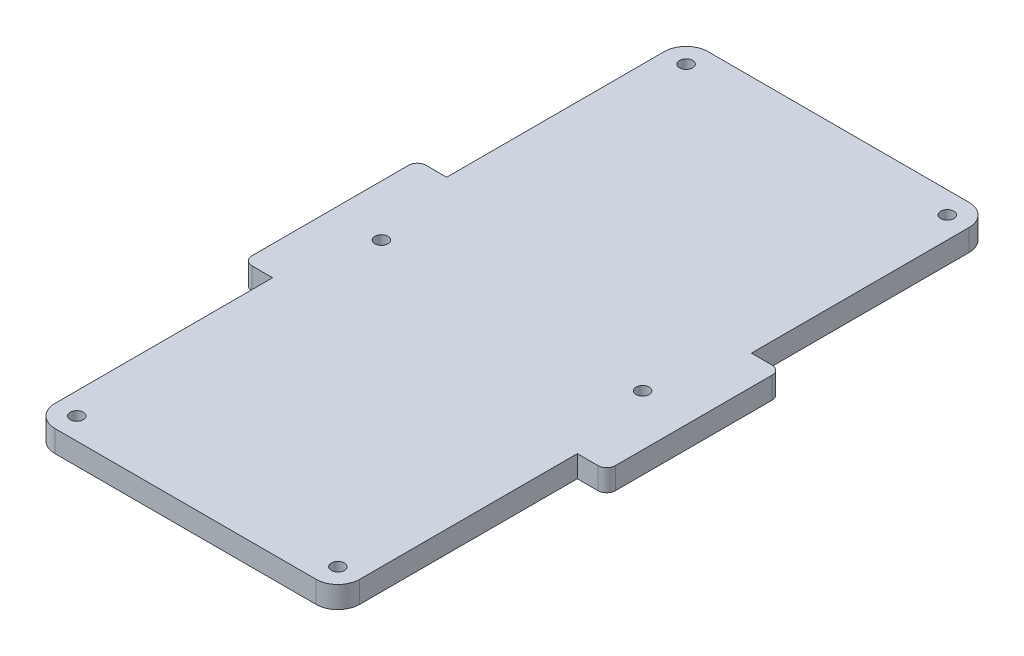
ISO-10303-21;
HEADER;
FILE_DESCRIPTION(('STEP AP214'),'2;1');
FILE_NAME('part.step','',(''),(''),'','','');
FILE_SCHEMA(('AUTOMOTIVE_DESIGN { 1 0 10303 214 1 1 1 1 }'));
ENDSEC;
DATA;
#1=APPLICATION_CONTEXT('core data for automotive mechanical design processes');
#2=APPLICATION_PROTOCOL_DEFINITION('international standard','automotive_design',2000,#1);
#3=PRODUCT_CONTEXT('',#1,'mechanical');
#4=PRODUCT('Part','Part','',(#3));
#5=PRODUCT_RELATED_PRODUCT_CATEGORY('part','',(#4));
#6=PRODUCT_DEFINITION_FORMATION('','',#4);
#7=PRODUCT_DEFINITION_CONTEXT('part definition',#1,'design');
#8=PRODUCT_DEFINITION('design','',#6,#7);
#9=PRODUCT_DEFINITION_SHAPE('','',#8);
#10=(LENGTH_UNIT() NAMED_UNIT(*) SI_UNIT(.MILLI.,.METRE.));
#11=(NAMED_UNIT(*) PLANE_ANGLE_UNIT() SI_UNIT($,.RADIAN.));
#12=(NAMED_UNIT(*) SI_UNIT($,.STERADIAN.) SOLID_ANGLE_UNIT());
#13=UNCERTAINTY_MEASURE_WITH_UNIT(LENGTH_MEASURE(1.E-05),#10,'distance_accuracy_value','');
#14=(GEOMETRIC_REPRESENTATION_CONTEXT(3) GLOBAL_UNCERTAINTY_ASSIGNED_CONTEXT((#13)) GLOBAL_UNIT_ASSIGNED_CONTEXT((#10,
#11,#12)) REPRESENTATION_CONTEXT('',''));
#15=CARTESIAN_POINT('',(0.,0.,0.));
#16=DIRECTION('',(0.,0.,1.));
#17=DIRECTION('',(1.,0.,0.));
#18=AXIS2_PLACEMENT_3D('',#15,#16,#17);
#19=CARTESIAN_POINT('',(-30.9298312789855,5.,48.840579710145));
#20=DIRECTION('',(1.,0.,0.));
#21=DIRECTION('',(0.,0.,-1.));
#22=AXIS2_PLACEMENT_3D('',#19,#20,#21);
#23=PLANE('',#22);
#24=DIRECTION('',(0.,0.,1.));
#25=VECTOR('',#24,1.);
#26=CARTESIAN_POINT('',(-30.9298312789855,0.,48.840579710145));
#27=LINE('',#26,#25);
#28=CARTESIAN_POINT('',(-30.9298312789855,0.,48.840579710145));
#29=VERTEX_POINT('',#28);
#30=CARTESIAN_POINT('',(-30.9298312789855,0.,98.840579710145));
#31=VERTEX_POINT('',#30);
#32=EDGE_CURVE('E204',#29,#31,#27,.T.);
#33=ORIENTED_EDGE('',*,*,#32,.T.);
#34=DIRECTION('',(0.,-1.,0.));
#35=VECTOR('',#34,1.);
#36=CARTESIAN_POINT('',(-30.9298312789855,5.,98.840579710145));
#37=LINE('',#36,#35);
#38=CARTESIAN_POINT('',(-30.9298312789855,5.,98.840579710145));
#39=VERTEX_POINT('',#38);
#40=EDGE_CURVE('E11',#39,#31,#37,.T.);
#41=ORIENTED_EDGE('',*,*,#40,.F.);
#42=DIRECTION('',(0.,0.,1.));
#43=VECTOR('',#42,1.);
#44=CARTESIAN_POINT('',(-30.9298312789855,5.,48.840579710145));
#45=LINE('',#44,#43);
#46=CARTESIAN_POINT('',(-30.9298312789855,5.,48.840579710145));
#47=VERTEX_POINT('',#46);
#48=EDGE_CURVE('E243',#47,#39,#45,.T.);
#49=ORIENTED_EDGE('',*,*,#48,.F.);
#50=DIRECTION('',(0.,-1.,0.));
#51=VECTOR('',#50,1.);
#52=CARTESIAN_POINT('',(-30.9298312789855,5.,48.840579710145));
#53=LINE('',#52,#51);
#54=EDGE_CURVE('E200',#47,#29,#53,.T.);
#55=ORIENTED_EDGE('',*,*,#54,.T.);
#56=EDGE_LOOP('',(#33,#41,#49,#55));
#57=FACE_BOUND('',#56,.T.);
#58=ADVANCED_FACE('F36',(#57),#23,.F.);
#59=CARTESIAN_POINT('',(-25.9298312789855,5.,98.840579710145));
#60=DIRECTION('',(0.,-1.,0.));
#61=DIRECTION('',(0.,0.,-1.));
#62=AXIS2_PLACEMENT_3D('',#59,#60,#61);
#63=CYLINDRICAL_SURFACE('',#62,5.);
#64=CARTESIAN_POINT('',(-25.9298312789855,0.,98.840579710145));
#65=DIRECTION('',(0.,1.,0.));
#66=DIRECTION('',(0.,0.,1.));
#67=AXIS2_PLACEMENT_3D('',#64,#65,#66);
#68=CIRCLE('',#67,5.);
#69=CARTESIAN_POINT('',(-25.9298312789854,0.,103.840579710145));
#70=VERTEX_POINT('',#69);
#71=EDGE_CURVE('E207',#31,#70,#68,.T.);
#72=ORIENTED_EDGE('',*,*,#71,.T.);
#73=DIRECTION('',(0.,-1.,0.));
#74=VECTOR('',#73,1.);
#75=CARTESIAN_POINT('',(-25.9298312789854,5.,103.840579710145));
#76=LINE('',#75,#74);
#77=CARTESIAN_POINT('',(-25.9298312789854,5.,103.840579710145));
#78=VERTEX_POINT('',#77);
#79=EDGE_CURVE('E44',#78,#70,#76,.T.);
#80=ORIENTED_EDGE('',*,*,#79,.F.);
#81=CARTESIAN_POINT('',(-25.9298312789855,5.,98.840579710145));
#82=DIRECTION('',(0.,1.,0.));
#83=DIRECTION('',(0.,0.,1.));
#84=AXIS2_PLACEMENT_3D('',#81,#82,#83);
#85=CIRCLE('',#84,5.);
#86=EDGE_CURVE('E131',#39,#78,#85,.T.);
#87=ORIENTED_EDGE('',*,*,#86,.F.);
#88=ORIENTED_EDGE('',*,*,#40,.T.);
#89=EDGE_LOOP('',(#72,#80,#87,#88));
#90=FACE_BOUND('',#89,.T.);
#91=ADVANCED_FACE('F362',(#90),#63,.T.);
#92=CARTESIAN_POINT('',(-25.9298312789854,5.,103.840579710145));
#93=DIRECTION('',(0.,0.,-1.));
#94=DIRECTION('',(-1.,0.,0.));
#95=AXIS2_PLACEMENT_3D('',#92,#93,#94);
#96=PLANE('',#95);
#97=DIRECTION('',(1.,0.,0.));
#98=VECTOR('',#97,1.);
#99=CARTESIAN_POINT('',(-25.9298312789854,0.,103.840579710145));
#100=LINE('',#99,#98);
#101=CARTESIAN_POINT('',(34.0701687210145,0.,103.840579710145));
#102=VERTEX_POINT('',#101);
#103=EDGE_CURVE('E210',#70,#102,#100,.T.);
#104=ORIENTED_EDGE('',*,*,#103,.T.);
#105=DIRECTION('',(0.,-1.,0.));
#106=VECTOR('',#105,1.);
#107=CARTESIAN_POINT('',(34.0701687210145,5.,103.840579710145));
#108=LINE('',#107,#106);
#109=CARTESIAN_POINT('',(34.0701687210145,5.,103.840579710145));
#110=VERTEX_POINT('',#109);
#111=EDGE_CURVE('E286',#110,#102,#108,.T.);
#112=ORIENTED_EDGE('',*,*,#111,.F.);
#113=DIRECTION('',(1.,0.,0.));
#114=VECTOR('',#113,1.);
#115=CARTESIAN_POINT('',(-25.9298312789854,5.,103.840579710145));
#116=LINE('',#115,#114);
#117=EDGE_CURVE('E294',#78,#110,#116,.T.);
#118=ORIENTED_EDGE('',*,*,#117,.F.);
#119=ORIENTED_EDGE('',*,*,#79,.T.);
#120=EDGE_LOOP('',(#104,#112,#118,#119));
#121=FACE_BOUND('',#120,.T.);
#122=ADVANCED_FACE('F292',(#121),#96,.F.);
#123=CARTESIAN_POINT('',(34.0701687210145,5.,98.840579710145));
#124=DIRECTION('',(0.,-1.,0.));
#125=DIRECTION('',(0.,0.,-1.));
#126=AXIS2_PLACEMENT_3D('',#123,#124,#125);
#127=CYLINDRICAL_SURFACE('',#126,5.);
#128=CARTESIAN_POINT('',(34.0701687210145,0.,98.840579710145));
#129=DIRECTION('',(0.,1.,0.));
#130=DIRECTION('',(0.,0.,1.));
#131=AXIS2_PLACEMENT_3D('',#128,#129,#130);
#132=CIRCLE('',#131,5.);
#133=CARTESIAN_POINT('',(39.0701687210145,0.,98.840579710145));
#134=VERTEX_POINT('',#133);
#135=EDGE_CURVE('E212',#102,#134,#132,.T.);
#136=ORIENTED_EDGE('',*,*,#135,.T.);
#137=DIRECTION('',(0.,-1.,0.));
#138=VECTOR('',#137,1.);
#139=CARTESIAN_POINT('',(39.0701687210145,5.,98.840579710145));
#140=LINE('',#139,#138);
#141=CARTESIAN_POINT('',(39.0701687210145,5.,98.840579710145));
#142=VERTEX_POINT('',#141);
#143=EDGE_CURVE('E283',#142,#134,#140,.T.);
#144=ORIENTED_EDGE('',*,*,#143,.F.);
#145=CARTESIAN_POINT('',(34.0701687210145,5.,98.840579710145));
#146=DIRECTION('',(0.,1.,0.));
#147=DIRECTION('',(0.,0.,1.));
#148=AXIS2_PLACEMENT_3D('',#145,#146,#147);
#149=CIRCLE('',#148,5.);
#150=EDGE_CURVE('E312',#110,#142,#149,.T.);
#151=ORIENTED_EDGE('',*,*,#150,.F.);
#152=ORIENTED_EDGE('',*,*,#111,.T.);
#153=EDGE_LOOP('',(#136,#144,#151,#152));
#154=FACE_BOUND('',#153,.T.);
#155=ADVANCED_FACE('F303',(#154),#127,.T.);
#156=CARTESIAN_POINT('',(39.0701687210146,5.,48.840579710145));
#157=DIRECTION('',(-1.,0.,0.));
#158=DIRECTION('',(0.,0.,1.));
#159=AXIS2_PLACEMENT_3D('',#156,#157,#158);
#160=PLANE('',#159);
#161=DIRECTION('',(0.,0.,-1.));
#162=VECTOR('',#161,1.);
#163=CARTESIAN_POINT('',(39.0701687210146,0.,48.840579710145));
#164=LINE('',#163,#162);
#165=CARTESIAN_POINT('',(39.0701687210146,0.,48.840579710145));
#166=VERTEX_POINT('',#165);
#167=EDGE_CURVE('E214',#134,#166,#164,.T.);
#168=ORIENTED_EDGE('',*,*,#167,.T.);
#169=DIRECTION('',(0.,-1.,0.));
#170=VECTOR('',#169,1.);
#171=CARTESIAN_POINT('',(39.0701687210146,5.,48.840579710145));
#172=LINE('',#171,#170);
#173=CARTESIAN_POINT('',(39.0701687210146,5.,48.840579710145));
#174=VERTEX_POINT('',#173);
#175=EDGE_CURVE('E280',#174,#166,#172,.T.);
#176=ORIENTED_EDGE('',*,*,#175,.F.);
#177=DIRECTION('',(0.,0.,-1.));
#178=VECTOR('',#177,1.);
#179=CARTESIAN_POINT('',(39.0701687210146,5.,48.840579710145));
#180=LINE('',#179,#178);
#181=EDGE_CURVE('E309',#142,#174,#180,.T.);
#182=ORIENTED_EDGE('',*,*,#181,.F.);
#183=ORIENTED_EDGE('',*,*,#143,.T.);
#184=EDGE_LOOP('',(#168,#176,#182,#183));
#185=FACE_BOUND('',#184,.T.);
#186=ADVANCED_FACE('F307',(#185),#160,.F.);
#187=CARTESIAN_POINT('',(43.8201687210145,5.,48.840579710145));
#188=DIRECTION('',(0.,0.,-1.));
#189=DIRECTION('',(-1.,0.,0.));
#190=AXIS2_PLACEMENT_3D('',#187,#188,#189);
#191=PLANE('',#190);
#192=DIRECTION('',(1.,0.,0.));
#193=VECTOR('',#192,1.);
#194=CARTESIAN_POINT('',(43.8201687210145,0.,48.840579710145));
#195=LINE('',#194,#193);
#196=CARTESIAN_POINT('',(43.8201687210145,0.,48.840579710145));
#197=VERTEX_POINT('',#196);
#198=EDGE_CURVE('E216',#166,#197,#195,.T.);
#199=ORIENTED_EDGE('',*,*,#198,.T.);
#200=DIRECTION('',(0.,-1.,0.));
#201=VECTOR('',#200,1.);
#202=CARTESIAN_POINT('',(43.8201687210145,5.,48.840579710145));
#203=LINE('',#202,#201);
#204=CARTESIAN_POINT('',(43.8201687210145,5.,48.840579710145));
#205=VERTEX_POINT('',#204);
#206=EDGE_CURVE('E277',#205,#197,#203,.T.);
#207=ORIENTED_EDGE('',*,*,#206,.F.);
#208=DIRECTION('',(1.,0.,0.));
#209=VECTOR('',#208,1.);
#210=CARTESIAN_POINT('',(43.8201687210145,5.,48.840579710145));
#211=LINE('',#210,#209);
#212=EDGE_CURVE('E311',#174,#205,#211,.T.);
#213=ORIENTED_EDGE('',*,*,#212,.F.);
#214=ORIENTED_EDGE('',*,*,#175,.T.);
#215=EDGE_LOOP('',(#199,#207,#213,#214));
#216=FACE_BOUND('',#215,.T.);
#217=ADVANCED_FACE('F375',(#216),#191,.F.);
#218=CARTESIAN_POINT('',(43.8201687210145,5.,46.8405797101451));
#219=DIRECTION('',(0.,-1.,0.));
#220=DIRECTION('',(0.,0.,-1.));
#221=AXIS2_PLACEMENT_3D('',#218,#219,#220);
#222=CYLINDRICAL_SURFACE('',#221,1.99999999999999);
#223=CARTESIAN_POINT('',(43.8201687210145,0.,46.8405797101451));
#224=DIRECTION('',(0.,1.,0.));
#225=DIRECTION('',(0.,0.,-1.));
#226=AXIS2_PLACEMENT_3D('',#223,#224,#225);
#227=CIRCLE('',#226,1.99999999999999);
#228=CARTESIAN_POINT('',(45.8201687210145,0.,46.8405797101451));
#229=VERTEX_POINT('',#228);
#230=EDGE_CURVE('E218',#197,#229,#227,.T.);
#231=ORIENTED_EDGE('',*,*,#230,.T.);
#232=DIRECTION('',(0.,-1.,0.));
#233=VECTOR('',#232,1.);
#234=CARTESIAN_POINT('',(45.8201687210145,5.,46.8405797101451));
#235=LINE('',#234,#233);
#236=CARTESIAN_POINT('',(45.8201687210145,5.,46.8405797101451));
#237=VERTEX_POINT('',#236);
#238=EDGE_CURVE('E274',#237,#229,#235,.T.);
#239=ORIENTED_EDGE('',*,*,#238,.F.);
#240=CARTESIAN_POINT('',(43.8201687210145,5.,46.8405797101451));
#241=DIRECTION('',(0.,1.,0.));
#242=DIRECTION('',(0.,0.,-1.));
#243=AXIS2_PLACEMENT_3D('',#240,#241,#242);
#244=CIRCLE('',#243,1.99999999999999);
#245=EDGE_CURVE('E314',#205,#237,#244,.T.);
#246=ORIENTED_EDGE('',*,*,#245,.F.);
#247=ORIENTED_EDGE('',*,*,#206,.T.);
#248=EDGE_LOOP('',(#231,#239,#246,#247));
#249=FACE_BOUND('',#248,.T.);
#250=ADVANCED_FACE('F378',(#249),#222,.T.);
#251=CARTESIAN_POINT('',(45.8201687210145,5.,10.8405797101451));
#252=DIRECTION('',(-1.,0.,0.));
#253=DIRECTION('',(0.,0.,1.));
#254=AXIS2_PLACEMENT_3D('',#251,#252,#253);
#255=PLANE('',#254);
#256=DIRECTION('',(0.,0.,-1.));
#257=VECTOR('',#256,1.);
#258=CARTESIAN_POINT('',(45.8201687210145,0.,10.8405797101451));
#259=LINE('',#258,#257);
#260=CARTESIAN_POINT('',(45.8201687210145,0.,10.8405797101451));
#261=VERTEX_POINT('',#260);
#262=EDGE_CURVE('E220',#229,#261,#259,.T.);
#263=ORIENTED_EDGE('',*,*,#262,.T.);
#264=DIRECTION('',(0.,-1.,0.));
#265=VECTOR('',#264,1.);
#266=CARTESIAN_POINT('',(45.8201687210145,5.,10.8405797101451));
#267=LINE('',#266,#265);
#268=CARTESIAN_POINT('',(45.8201687210145,5.,10.8405797101451));
#269=VERTEX_POINT('',#268);
#270=EDGE_CURVE('E271',#269,#261,#267,.T.);
#271=ORIENTED_EDGE('',*,*,#270,.F.);
#272=DIRECTION('',(0.,0.,-1.));
#273=VECTOR('',#272,1.);
#274=CARTESIAN_POINT('',(45.8201687210145,5.,10.8405797101451));
#275=LINE('',#274,#273);
#276=EDGE_CURVE('E320',#237,#269,#275,.T.);
#277=ORIENTED_EDGE('',*,*,#276,.F.);
#278=ORIENTED_EDGE('',*,*,#238,.T.);
#279=EDGE_LOOP('',(#263,#271,#277,#278));
#280=FACE_BOUND('',#279,.T.);
#281=ADVANCED_FACE('F382',(#280),#255,.F.);
#282=CARTESIAN_POINT('',(43.8201687210145,5.,10.840579710145));
#283=DIRECTION('',(0.,-1.,0.));
#284=DIRECTION('',(0.,0.,-1.));
#285=AXIS2_PLACEMENT_3D('',#282,#283,#284);
#286=CYLINDRICAL_SURFACE('',#285,2.);
#287=CARTESIAN_POINT('',(43.8201687210145,0.,10.840579710145));
#288=DIRECTION('',(0.,1.,0.));
#289=DIRECTION('',(0.,0.,1.));
#290=AXIS2_PLACEMENT_3D('',#287,#288,#289);
#291=CIRCLE('',#290,2.);
#292=CARTESIAN_POINT('',(43.8201687210145,0.,8.84057971014504));
#293=VERTEX_POINT('',#292);
#294=EDGE_CURVE('E222',#261,#293,#291,.T.);
#295=ORIENTED_EDGE('',*,*,#294,.T.);
#296=DIRECTION('',(0.,-1.,0.));
#297=VECTOR('',#296,1.);
#298=CARTESIAN_POINT('',(43.8201687210145,5.,8.84057971014504));
#299=LINE('',#298,#297);
#300=CARTESIAN_POINT('',(43.8201687210145,5.,8.84057971014504));
#301=VERTEX_POINT('',#300);
#302=EDGE_CURVE('E268',#301,#293,#299,.T.);
#303=ORIENTED_EDGE('',*,*,#302,.F.);
#304=CARTESIAN_POINT('',(43.8201687210145,5.,10.840579710145));
#305=DIRECTION('',(0.,1.,0.));
#306=DIRECTION('',(0.,0.,1.));
#307=AXIS2_PLACEMENT_3D('',#304,#305,#306);
#308=CIRCLE('',#307,2.);
#309=EDGE_CURVE('E322',#269,#301,#308,.T.);
#310=ORIENTED_EDGE('',*,*,#309,.F.);
#311=ORIENTED_EDGE('',*,*,#270,.T.);
#312=EDGE_LOOP('',(#295,#303,#310,#311));
#313=FACE_BOUND('',#312,.T.);
#314=ADVANCED_FACE('F386',(#313),#286,.T.);
#315=CARTESIAN_POINT('',(43.8201687210145,5.,8.84057971014504));
#316=DIRECTION('',(0.,0.,1.));
#317=DIRECTION('',(1.,0.,0.));
#318=AXIS2_PLACEMENT_3D('',#315,#316,#317);
#319=PLANE('',#318);
#320=DIRECTION('',(-1.,0.,0.));
#321=VECTOR('',#320,1.);
#322=CARTESIAN_POINT('',(43.8201687210145,0.,8.84057971014504));
#323=LINE('',#322,#321);
#324=CARTESIAN_POINT('',(39.0701687210145,0.,8.84057971014504));
#325=VERTEX_POINT('',#324);
#326=EDGE_CURVE('E224',#293,#325,#323,.T.);
#327=ORIENTED_EDGE('',*,*,#326,.T.);
#328=DIRECTION('',(0.,-1.,0.));
#329=VECTOR('',#328,1.);
#330=CARTESIAN_POINT('',(39.0701687210145,5.,8.84057971014504));
#331=LINE('',#330,#329);
#332=CARTESIAN_POINT('',(39.0701687210145,5.,8.84057971014504));
#333=VERTEX_POINT('',#332);
#334=EDGE_CURVE('E265',#333,#325,#331,.T.);
#335=ORIENTED_EDGE('',*,*,#334,.F.);
#336=DIRECTION('',(-1.,0.,0.));
#337=VECTOR('',#336,1.);
#338=CARTESIAN_POINT('',(43.8201687210145,5.,8.84057971014504));
#339=LINE('',#338,#337);
#340=EDGE_CURVE('E324',#301,#333,#339,.T.);
#341=ORIENTED_EDGE('',*,*,#340,.F.);
#342=ORIENTED_EDGE('',*,*,#302,.T.);
#343=EDGE_LOOP('',(#327,#335,#341,#342));
#344=FACE_BOUND('',#343,.T.);
#345=ADVANCED_FACE('F390',(#344),#319,.F.);
#346=CARTESIAN_POINT('',(39.0701687210145,5.,-41.1594202898549));
#347=DIRECTION('',(-1.,0.,0.));
#348=DIRECTION('',(0.,0.,1.));
#349=AXIS2_PLACEMENT_3D('',#346,#347,#348);
#350=PLANE('',#349);
#351=DIRECTION('',(0.,0.,-1.));
#352=VECTOR('',#351,1.);
#353=CARTESIAN_POINT('',(39.0701687210145,0.,-41.1594202898549));
#354=LINE('',#353,#352);
#355=CARTESIAN_POINT('',(39.0701687210145,0.,-41.1594202898549));
#356=VERTEX_POINT('',#355);
#357=EDGE_CURVE('E226',#325,#356,#354,.T.);
#358=ORIENTED_EDGE('',*,*,#357,.T.);
#359=DIRECTION('',(0.,-1.,0.));
#360=VECTOR('',#359,1.);
#361=CARTESIAN_POINT('',(39.0701687210145,5.,-41.1594202898549));
#362=LINE('',#361,#360);
#363=CARTESIAN_POINT('',(39.0701687210145,5.,-41.1594202898549));
#364=VERTEX_POINT('',#363);
#365=EDGE_CURVE('E262',#364,#356,#362,.T.);
#366=ORIENTED_EDGE('',*,*,#365,.F.);
#367=DIRECTION('',(0.,0.,-1.));
#368=VECTOR('',#367,1.);
#369=CARTESIAN_POINT('',(39.0701687210145,5.,-41.1594202898549));
#370=LINE('',#369,#368);
#371=EDGE_CURVE('E326',#333,#364,#370,.T.);
#372=ORIENTED_EDGE('',*,*,#371,.F.);
#373=ORIENTED_EDGE('',*,*,#334,.T.);
#374=EDGE_LOOP('',(#358,#366,#372,#373));
#375=FACE_BOUND('',#374,.T.);
#376=ADVANCED_FACE('F394',(#375),#350,.F.);
#377=CARTESIAN_POINT('',(34.0701687210145,5.,-41.159420289855));
#378=DIRECTION('',(0.,-1.,0.));
#379=DIRECTION('',(0.,0.,-1.));
#380=AXIS2_PLACEMENT_3D('',#377,#378,#379);
#381=CYLINDRICAL_SURFACE('',#380,5.);
#382=CARTESIAN_POINT('',(34.0701687210145,0.,-41.159420289855));
#383=DIRECTION('',(0.,1.,0.));
#384=DIRECTION('',(0.,0.,1.));
#385=AXIS2_PLACEMENT_3D('',#382,#383,#384);
#386=CIRCLE('',#385,5.);
#387=CARTESIAN_POINT('',(34.0701687210145,0.,-46.1594202898549));
#388=VERTEX_POINT('',#387);
#389=EDGE_CURVE('E228',#356,#388,#386,.T.);
#390=ORIENTED_EDGE('',*,*,#389,.T.);
#391=DIRECTION('',(0.,-1.,0.));
#392=VECTOR('',#391,1.);
#393=CARTESIAN_POINT('',(34.0701687210145,5.,-46.1594202898549));
#394=LINE('',#393,#392);
#395=CARTESIAN_POINT('',(34.0701687210145,5.,-46.1594202898549));
#396=VERTEX_POINT('',#395);
#397=EDGE_CURVE('E259',#396,#388,#394,.T.);
#398=ORIENTED_EDGE('',*,*,#397,.F.);
#399=CARTESIAN_POINT('',(34.0701687210145,5.,-41.159420289855));
#400=DIRECTION('',(0.,1.,0.));
#401=DIRECTION('',(0.,0.,1.));
#402=AXIS2_PLACEMENT_3D('',#399,#400,#401);
#403=CIRCLE('',#402,5.);
#404=EDGE_CURVE('E328',#364,#396,#403,.T.);
#405=ORIENTED_EDGE('',*,*,#404,.F.);
#406=ORIENTED_EDGE('',*,*,#365,.T.);
#407=EDGE_LOOP('',(#390,#398,#405,#406));
#408=FACE_BOUND('',#407,.T.);
#409=ADVANCED_FACE('F398',(#408),#381,.T.);
#410=CARTESIAN_POINT('',(-25.9298312789855,5.,-46.1594202898549));
#411=DIRECTION('',(0.,0.,1.));
#412=DIRECTION('',(1.,0.,0.));
#413=AXIS2_PLACEMENT_3D('',#410,#411,#412);
#414=PLANE('',#413);
#415=DIRECTION('',(-1.,0.,0.));
#416=VECTOR('',#415,1.);
#417=CARTESIAN_POINT('',(-25.9298312789855,0.,-46.1594202898549));
#418=LINE('',#417,#416);
#419=CARTESIAN_POINT('',(-25.9298312789855,0.,-46.1594202898549));
#420=VERTEX_POINT('',#419);
#421=EDGE_CURVE('E230',#388,#420,#418,.T.);
#422=ORIENTED_EDGE('',*,*,#421,.T.);
#423=DIRECTION('',(0.,-1.,0.));
#424=VECTOR('',#423,1.);
#425=CARTESIAN_POINT('',(-25.9298312789855,5.,-46.1594202898549));
#426=LINE('',#425,#424);
#427=CARTESIAN_POINT('',(-25.9298312789855,5.,-46.1594202898549));
#428=VERTEX_POINT('',#427);
#429=EDGE_CURVE('E256',#428,#420,#426,.T.);
#430=ORIENTED_EDGE('',*,*,#429,.F.);
#431=DIRECTION('',(-1.,0.,0.));
#432=VECTOR('',#431,1.);
#433=CARTESIAN_POINT('',(-25.9298312789855,5.,-46.1594202898549));
#434=LINE('',#433,#432);
#435=EDGE_CURVE('E330',#396,#428,#434,.T.);
#436=ORIENTED_EDGE('',*,*,#435,.F.);
#437=ORIENTED_EDGE('',*,*,#397,.T.);
#438=EDGE_LOOP('',(#422,#430,#436,#437));
#439=FACE_BOUND('',#438,.T.);
#440=ADVANCED_FACE('F402',(#439),#414,.F.);
#441=CARTESIAN_POINT('',(-25.9298312789855,5.,-41.159420289855));
#442=DIRECTION('',(0.,-1.,0.));
#443=DIRECTION('',(0.,0.,-1.));
#444=AXIS2_PLACEMENT_3D('',#441,#442,#443);
#445=CYLINDRICAL_SURFACE('',#444,5.);
#446=CARTESIAN_POINT('',(-25.9298312789855,0.,-41.159420289855));
#447=DIRECTION('',(0.,1.,0.));
#448=DIRECTION('',(0.,0.,-1.));
#449=AXIS2_PLACEMENT_3D('',#446,#447,#448);
#450=CIRCLE('',#449,5.);
#451=CARTESIAN_POINT('',(-30.9298312789855,0.,-41.1594202898549));
#452=VERTEX_POINT('',#451);
#453=EDGE_CURVE('E232',#420,#452,#450,.T.);
#454=ORIENTED_EDGE('',*,*,#453,.T.);
#455=DIRECTION('',(0.,-1.,0.));
#456=VECTOR('',#455,1.);
#457=CARTESIAN_POINT('',(-30.9298312789855,5.,-41.1594202898549));
#458=LINE('',#457,#456);
#459=CARTESIAN_POINT('',(-30.9298312789855,5.,-41.1594202898549));
#460=VERTEX_POINT('',#459);
#461=EDGE_CURVE('E253',#460,#452,#458,.T.);
#462=ORIENTED_EDGE('',*,*,#461,.F.);
#463=CARTESIAN_POINT('',(-25.9298312789855,5.,-41.159420289855));
#464=DIRECTION('',(0.,1.,0.));
#465=DIRECTION('',(0.,0.,-1.));
#466=AXIS2_PLACEMENT_3D('',#463,#464,#465);
#467=CIRCLE('',#466,5.);
#468=EDGE_CURVE('E332',#428,#460,#467,.T.);
#469=ORIENTED_EDGE('',*,*,#468,.F.);
#470=ORIENTED_EDGE('',*,*,#429,.T.);
#471=EDGE_LOOP('',(#454,#462,#469,#470));
#472=FACE_BOUND('',#471,.T.);
#473=ADVANCED_FACE('F406',(#472),#445,.T.);
#474=CARTESIAN_POINT('',(-30.9298312789855,5.,-41.1594202898549));
#475=DIRECTION('',(1.,0.,0.));
#476=DIRECTION('',(0.,0.,-1.));
#477=AXIS2_PLACEMENT_3D('',#474,#475,#476);
#478=PLANE('',#477);
#479=DIRECTION('',(0.,0.,1.));
#480=VECTOR('',#479,1.);
#481=CARTESIAN_POINT('',(-30.9298312789855,0.,-41.1594202898549));
#482=LINE('',#481,#480);
#483=CARTESIAN_POINT('',(-30.9298312789855,0.,8.84057971014504));
#484=VERTEX_POINT('',#483);
#485=EDGE_CURVE('E234',#452,#484,#482,.T.);
#486=ORIENTED_EDGE('',*,*,#485,.T.);
#487=DIRECTION('',(0.,-1.,0.));
#488=VECTOR('',#487,1.);
#489=CARTESIAN_POINT('',(-30.9298312789855,5.,8.84057971014504));
#490=LINE('',#489,#488);
#491=CARTESIAN_POINT('',(-30.9298312789855,5.,8.84057971014504));
#492=VERTEX_POINT('',#491);
#493=EDGE_CURVE('E250',#492,#484,#490,.T.);
#494=ORIENTED_EDGE('',*,*,#493,.F.);
#495=DIRECTION('',(0.,0.,1.));
#496=VECTOR('',#495,1.);
#497=CARTESIAN_POINT('',(-30.9298312789855,5.,-41.1594202898549));
#498=LINE('',#497,#496);
#499=EDGE_CURVE('E334',#460,#492,#498,.T.);
#500=ORIENTED_EDGE('',*,*,#499,.F.);
#501=ORIENTED_EDGE('',*,*,#461,.T.);
#502=EDGE_LOOP('',(#486,#494,#500,#501));
#503=FACE_BOUND('',#502,.T.);
#504=ADVANCED_FACE('F410',(#503),#478,.F.);
#505=CARTESIAN_POINT('',(-35.6798312789855,5.,8.84057971014504));
#506=DIRECTION('',(0.,0.,1.));
#507=DIRECTION('',(1.,0.,0.));
#508=AXIS2_PLACEMENT_3D('',#505,#506,#507);
#509=PLANE('',#508);
#510=DIRECTION('',(-1.,0.,0.));
#511=VECTOR('',#510,1.);
#512=CARTESIAN_POINT('',(-35.6798312789855,0.,8.84057971014504));
#513=LINE('',#512,#511);
#514=CARTESIAN_POINT('',(-35.6798312789855,0.,8.84057971014504));
#515=VERTEX_POINT('',#514);
#516=EDGE_CURVE('E236',#484,#515,#513,.T.);
#517=ORIENTED_EDGE('',*,*,#516,.T.);
#518=DIRECTION('',(0.,-1.,0.));
#519=VECTOR('',#518,1.);
#520=CARTESIAN_POINT('',(-35.6798312789855,5.,8.84057971014504));
#521=LINE('',#520,#519);
#522=CARTESIAN_POINT('',(-35.6798312789855,5.,8.84057971014504));
#523=VERTEX_POINT('',#522);
#524=EDGE_CURVE('E247',#523,#515,#521,.T.);
#525=ORIENTED_EDGE('',*,*,#524,.F.);
#526=DIRECTION('',(-1.,0.,0.));
#527=VECTOR('',#526,1.);
#528=CARTESIAN_POINT('',(-35.6798312789855,5.,8.84057971014504));
#529=LINE('',#528,#527);
#530=EDGE_CURVE('E336',#492,#523,#529,.T.);
#531=ORIENTED_EDGE('',*,*,#530,.F.);
#532=ORIENTED_EDGE('',*,*,#493,.T.);
#533=EDGE_LOOP('',(#517,#525,#531,#532));
#534=FACE_BOUND('',#533,.T.);
#535=ADVANCED_FACE('F342',(#534),#509,.F.);
#536=CARTESIAN_POINT('',(-35.6798312789855,5.,10.840579710145));
#537=DIRECTION('',(0.,-1.,0.));
#538=DIRECTION('',(0.,0.,-1.));
#539=AXIS2_PLACEMENT_3D('',#536,#537,#538);
#540=CYLINDRICAL_SURFACE('',#539,2.);
#541=CARTESIAN_POINT('',(-35.6798312789855,0.,10.840579710145));
#542=DIRECTION('',(0.,1.,0.));
#543=DIRECTION('',(0.,0.,-1.));
#544=AXIS2_PLACEMENT_3D('',#541,#542,#543);
#545=CIRCLE('',#544,2.);
#546=CARTESIAN_POINT('',(-37.6798312789855,0.,10.8405797101451));
#547=VERTEX_POINT('',#546);
#548=EDGE_CURVE('E238',#515,#547,#545,.T.);
#549=ORIENTED_EDGE('',*,*,#548,.T.);
#550=DIRECTION('',(0.,-1.,0.));
#551=VECTOR('',#550,1.);
#552=CARTESIAN_POINT('',(-37.6798312789855,5.,10.8405797101451));
#553=LINE('',#552,#551);
#554=CARTESIAN_POINT('',(-37.6798312789855,5.,10.8405797101451));
#555=VERTEX_POINT('',#554);
#556=EDGE_CURVE('E195',#555,#547,#553,.T.);
#557=ORIENTED_EDGE('',*,*,#556,.F.);
#558=CARTESIAN_POINT('',(-35.6798312789855,5.,10.840579710145));
#559=DIRECTION('',(0.,1.,0.));
#560=DIRECTION('',(0.,0.,-1.));
#561=AXIS2_PLACEMENT_3D('',#558,#559,#560);
#562=CIRCLE('',#561,2.);
#563=EDGE_CURVE('E186',#523,#555,#562,.T.);
#564=ORIENTED_EDGE('',*,*,#563,.F.);
#565=ORIENTED_EDGE('',*,*,#524,.T.);
#566=EDGE_LOOP('',(#549,#557,#564,#565));
#567=FACE_BOUND('',#566,.T.);
#568=ADVANCED_FACE('F346',(#567),#540,.T.);
#569=CARTESIAN_POINT('',(-37.6798312789855,5.,10.8405797101451));
#570=DIRECTION('',(1.,0.,0.));
#571=DIRECTION('',(0.,0.,-1.));
#572=AXIS2_PLACEMENT_3D('',#569,#570,#571);
#573=PLANE('',#572);
#574=DIRECTION('',(0.,0.,1.));
#575=VECTOR('',#574,1.);
#576=CARTESIAN_POINT('',(-37.6798312789855,0.,10.8405797101451));
#577=LINE('',#576,#575);
#578=CARTESIAN_POINT('',(-37.6798312789855,0.,46.8405797101451));
#579=VERTEX_POINT('',#578);
#580=EDGE_CURVE('E194',#547,#579,#577,.T.);
#581=ORIENTED_EDGE('',*,*,#580,.T.);
#582=DIRECTION('',(0.,-1.,0.));
#583=VECTOR('',#582,1.);
#584=CARTESIAN_POINT('',(-37.6798312789855,5.,46.8405797101451));
#585=LINE('',#584,#583);
#586=CARTESIAN_POINT('',(-37.6798312789855,5.,46.8405797101451));
#587=VERTEX_POINT('',#586);
#588=EDGE_CURVE('E191',#587,#579,#585,.T.);
#589=ORIENTED_EDGE('',*,*,#588,.F.);
#590=DIRECTION('',(0.,0.,1.));
#591=VECTOR('',#590,1.);
#592=CARTESIAN_POINT('',(-37.6798312789855,5.,10.8405797101451));
#593=LINE('',#592,#591);
#594=EDGE_CURVE('E180',#555,#587,#593,.T.);
#595=ORIENTED_EDGE('',*,*,#594,.F.);
#596=ORIENTED_EDGE('',*,*,#556,.T.);
#597=EDGE_LOOP('',(#581,#589,#595,#596));
#598=FACE_BOUND('',#597,.T.);
#599=ADVANCED_FACE('F192',(#598),#573,.F.);
#600=CARTESIAN_POINT('',(-35.6798312789855,5.,46.8405797101451));
#601=DIRECTION('',(0.,-1.,0.));
#602=DIRECTION('',(0.,0.,-1.));
#603=AXIS2_PLACEMENT_3D('',#600,#601,#602);
#604=CYLINDRICAL_SURFACE('',#603,2.00000000000001);
#605=CARTESIAN_POINT('',(-35.6798312789855,0.,46.8405797101451));
#606=DIRECTION('',(0.,1.,0.));
#607=DIRECTION('',(0.,0.,-1.));
#608=AXIS2_PLACEMENT_3D('',#605,#606,#607);
#609=CIRCLE('',#608,2.00000000000001);
#610=CARTESIAN_POINT('',(-35.6798312789855,0.,48.8405797101451));
#611=VERTEX_POINT('',#610);
#612=EDGE_CURVE('E117',#579,#611,#609,.T.);
#613=ORIENTED_EDGE('',*,*,#612,.T.);
#614=DIRECTION('',(0.,-1.,0.));
#615=VECTOR('',#614,1.);
#616=CARTESIAN_POINT('',(-35.6798312789855,5.,48.8405797101451));
#617=LINE('',#616,#615);
#618=CARTESIAN_POINT('',(-35.6798312789855,5.,48.8405797101451));
#619=VERTEX_POINT('',#618);
#620=EDGE_CURVE('E196',#619,#611,#617,.T.);
#621=ORIENTED_EDGE('',*,*,#620,.F.);
#622=CARTESIAN_POINT('',(-35.6798312789855,5.,46.8405797101451));
#623=DIRECTION('',(0.,1.,0.));
#624=DIRECTION('',(0.,0.,-1.));
#625=AXIS2_PLACEMENT_3D('',#622,#623,#624);
#626=CIRCLE('',#625,2.00000000000001);
#627=EDGE_CURVE('E184',#587,#619,#626,.T.);
#628=ORIENTED_EDGE('',*,*,#627,.F.);
#629=ORIENTED_EDGE('',*,*,#588,.T.);
#630=EDGE_LOOP('',(#613,#621,#628,#629));
#631=FACE_BOUND('',#630,.T.);
#632=ADVANCED_FACE('F198',(#631),#604,.T.);
#633=CARTESIAN_POINT('',(-35.6798312789855,5.,48.8405797101451));
#634=DIRECTION('',(0.,0.,-1.));
#635=DIRECTION('',(-1.,0.,0.));
#636=AXIS2_PLACEMENT_3D('',#633,#634,#635);
#637=PLANE('',#636);
#638=DIRECTION('',(1.,0.,0.));
#639=VECTOR('',#638,1.);
#640=CARTESIAN_POINT('',(-35.6798312789855,0.,48.8405797101451));
#641=LINE('',#640,#639);
#642=EDGE_CURVE('E123',#611,#29,#641,.T.);
#643=ORIENTED_EDGE('',*,*,#642,.T.);
#644=ORIENTED_EDGE('',*,*,#54,.F.);
#645=DIRECTION('',(1.,0.,0.));
#646=VECTOR('',#645,1.);
#647=CARTESIAN_POINT('',(-35.6798312789855,5.,48.8405797101451));
#648=LINE('',#647,#646);
#649=EDGE_CURVE('E52',#619,#47,#648,.T.);
#650=ORIENTED_EDGE('',*,*,#649,.F.);
#651=ORIENTED_EDGE('',*,*,#620,.T.);
#652=EDGE_LOOP('',(#643,#644,#650,#651));
#653=FACE_BOUND('',#652,.T.);
#654=ADVANCED_FACE('F350',(#653),#637,.F.);
#655=CARTESIAN_POINT('',(-25.9298312789855,5.,98.840579710145));
#656=DIRECTION('',(0.,1.,0.));
#657=DIRECTION('',(0.,0.,1.));
#658=AXIS2_PLACEMENT_3D('',#655,#656,#657);
#659=PLANE('',#658);
#660=CARTESIAN_POINT('',(-25.9298312789855,5.,-41.159420289855));
#661=DIRECTION('',(0.,1.,0.));
#662=DIRECTION('',(0.,0.,1.));
#663=AXIS2_PLACEMENT_3D('',#660,#661,#662);
#664=CIRCLE('',#663,1.5);
#665=CARTESIAN_POINT('',(-25.9298312789855,5.,-39.659420289855));
#666=VERTEX_POINT('',#665);
#667=EDGE_CURVE('E516',#666,#666,#664,.T.);
#668=ORIENTED_EDGE('',*,*,#667,.F.);
#669=EDGE_LOOP('',(#668));
#670=FACE_BOUND('',#669,.T.);
#671=CARTESIAN_POINT('',(-25.9298312789855,5.,98.840579710145));
#672=DIRECTION('',(0.,1.,0.));
#673=DIRECTION('',(0.,0.,1.));
#674=AXIS2_PLACEMENT_3D('',#671,#672,#673);
#675=CIRCLE('',#674,1.5);
#676=CARTESIAN_POINT('',(-25.9298312789855,5.,100.340579710145));
#677=VERTEX_POINT('',#676);
#678=EDGE_CURVE('E522',#677,#677,#675,.T.);
#679=ORIENTED_EDGE('',*,*,#678,.F.);
#680=EDGE_LOOP('',(#679));
#681=FACE_BOUND('',#680,.T.);
#682=CARTESIAN_POINT('',(34.0701687210145,5.,98.840579710145));
#683=DIRECTION('',(0.,1.,0.));
#684=DIRECTION('',(0.,0.,1.));
#685=AXIS2_PLACEMENT_3D('',#682,#683,#684);
#686=CIRCLE('',#685,1.5);
#687=CARTESIAN_POINT('',(34.0701687210145,5.,100.340579710145));
#688=VERTEX_POINT('',#687);
#689=EDGE_CURVE('E531',#688,#688,#686,.T.);
#690=ORIENTED_EDGE('',*,*,#689,.F.);
#691=EDGE_LOOP('',(#690));
#692=FACE_BOUND('',#691,.T.);
#693=CARTESIAN_POINT('',(34.0701687210145,5.,28.8405797101451));
#694=DIRECTION('',(0.,1.,0.));
#695=DIRECTION('',(0.,0.,1.));
#696=AXIS2_PLACEMENT_3D('',#693,#694,#695);
#697=CIRCLE('',#696,1.5);
#698=CARTESIAN_POINT('',(34.0701687210145,5.,30.3405797101451));
#699=VERTEX_POINT('',#698);
#700=EDGE_CURVE('E537',#699,#699,#697,.T.);
#701=ORIENTED_EDGE('',*,*,#700,.F.);
#702=EDGE_LOOP('',(#701));
#703=FACE_BOUND('',#702,.T.);
#704=CARTESIAN_POINT('',(-25.9298312789855,5.,28.8405797101451));
#705=DIRECTION('',(0.,1.,0.));
#706=DIRECTION('',(0.,0.,1.));
#707=AXIS2_PLACEMENT_3D('',#704,#705,#706);
#708=CIRCLE('',#707,1.5);
#709=CARTESIAN_POINT('',(-25.9298312789855,5.,30.3405797101451));
#710=VERTEX_POINT('',#709);
#711=EDGE_CURVE('E554',#710,#710,#708,.T.);
#712=ORIENTED_EDGE('',*,*,#711,.F.);
#713=EDGE_LOOP('',(#712));
#714=FACE_BOUND('',#713,.T.);
#715=CARTESIAN_POINT('',(34.0701687210145,5.,-41.159420289855));
#716=DIRECTION('',(0.,1.,0.));
#717=DIRECTION('',(0.,0.,1.));
#718=AXIS2_PLACEMENT_3D('',#715,#716,#717);
#719=CIRCLE('',#718,1.5);
#720=CARTESIAN_POINT('',(34.0701687210145,5.,-39.659420289855));
#721=VERTEX_POINT('',#720);
#722=EDGE_CURVE('E519',#721,#721,#719,.T.);
#723=ORIENTED_EDGE('',*,*,#722,.F.);
#724=EDGE_LOOP('',(#723));
#725=FACE_BOUND('',#724,.T.);
#726=ORIENTED_EDGE('',*,*,#48,.T.);
#727=ORIENTED_EDGE('',*,*,#86,.T.);
#728=ORIENTED_EDGE('',*,*,#117,.T.);
#729=ORIENTED_EDGE('',*,*,#150,.T.);
#730=ORIENTED_EDGE('',*,*,#181,.T.);
#731=ORIENTED_EDGE('',*,*,#212,.T.);
#732=ORIENTED_EDGE('',*,*,#245,.T.);
#733=ORIENTED_EDGE('',*,*,#276,.T.);
#734=ORIENTED_EDGE('',*,*,#309,.T.);
#735=ORIENTED_EDGE('',*,*,#340,.T.);
#736=ORIENTED_EDGE('',*,*,#371,.T.);
#737=ORIENTED_EDGE('',*,*,#404,.T.);
#738=ORIENTED_EDGE('',*,*,#435,.T.);
#739=ORIENTED_EDGE('',*,*,#468,.T.);
#740=ORIENTED_EDGE('',*,*,#499,.T.);
#741=ORIENTED_EDGE('',*,*,#530,.T.);
#742=ORIENTED_EDGE('',*,*,#563,.T.);
#743=ORIENTED_EDGE('',*,*,#594,.T.);
#744=ORIENTED_EDGE('',*,*,#627,.T.);
#745=ORIENTED_EDGE('',*,*,#649,.T.);
#746=EDGE_LOOP('',(#726,#727,#728,#729,#730,#731,#732,#733,#734,#735,#736,#737,#738,#739,#740,
#741,#742,#743,#744,#745));
#747=FACE_BOUND('',#746,.T.);
#748=ADVANCED_FACE('F182',(#670,#681,#692,#703,#714,#725,#747),#659,.T.);
#749=CARTESIAN_POINT('',(-25.9298312789855,0.,98.840579710145));
#750=DIRECTION('',(0.,1.,0.));
#751=DIRECTION('',(0.,0.,1.));
#752=AXIS2_PLACEMENT_3D('',#749,#750,#751);
#753=PLANE('',#752);
#754=CARTESIAN_POINT('',(-25.9298312789855,0.,-41.159420289855));
#755=DIRECTION('',(0.,1.,0.));
#756=DIRECTION('',(0.,0.,1.));
#757=AXIS2_PLACEMENT_3D('',#754,#755,#756);
#758=CIRCLE('',#757,1.5);
#759=CARTESIAN_POINT('',(-25.9298312789855,0.,-39.659420289855));
#760=VERTEX_POINT('',#759);
#761=EDGE_CURVE('E513',#760,#760,#758,.T.);
#762=ORIENTED_EDGE('',*,*,#761,.T.);
#763=EDGE_LOOP('',(#762));
#764=FACE_BOUND('',#763,.T.);
#765=CARTESIAN_POINT('',(-25.9298312789855,0.,98.840579710145));
#766=DIRECTION('',(0.,1.,0.));
#767=DIRECTION('',(0.,0.,1.));
#768=AXIS2_PLACEMENT_3D('',#765,#766,#767);
#769=CIRCLE('',#768,1.5);
#770=CARTESIAN_POINT('',(-25.9298312789855,0.,100.340579710145));
#771=VERTEX_POINT('',#770);
#772=EDGE_CURVE('E517',#771,#771,#769,.T.);
#773=ORIENTED_EDGE('',*,*,#772,.T.);
#774=EDGE_LOOP('',(#773));
#775=FACE_BOUND('',#774,.T.);
#776=CARTESIAN_POINT('',(34.0701687210145,0.,98.840579710145));
#777=DIRECTION('',(0.,1.,0.));
#778=DIRECTION('',(0.,0.,1.));
#779=AXIS2_PLACEMENT_3D('',#776,#777,#778);
#780=CIRCLE('',#779,1.5);
#781=CARTESIAN_POINT('',(34.0701687210145,0.,100.340579710145));
#782=VERTEX_POINT('',#781);
#783=EDGE_CURVE('E528',#782,#782,#780,.T.);
#784=ORIENTED_EDGE('',*,*,#783,.T.);
#785=EDGE_LOOP('',(#784));
#786=FACE_BOUND('',#785,.T.);
#787=CARTESIAN_POINT('',(34.0701687210145,0.,28.8405797101451));
#788=DIRECTION('',(0.,1.,0.));
#789=DIRECTION('',(0.,0.,1.));
#790=AXIS2_PLACEMENT_3D('',#787,#788,#789);
#791=CIRCLE('',#790,1.5);
#792=CARTESIAN_POINT('',(34.0701687210145,0.,30.3405797101451));
#793=VERTEX_POINT('',#792);
#794=EDGE_CURVE('E534',#793,#793,#791,.T.);
#795=ORIENTED_EDGE('',*,*,#794,.T.);
#796=EDGE_LOOP('',(#795));
#797=FACE_BOUND('',#796,.T.);
#798=CARTESIAN_POINT('',(-25.9298312789855,0.,28.8405797101451));
#799=DIRECTION('',(0.,1.,0.));
#800=DIRECTION('',(0.,0.,1.));
#801=AXIS2_PLACEMENT_3D('',#798,#799,#800);
#802=CIRCLE('',#801,1.5);
#803=CARTESIAN_POINT('',(-25.9298312789855,0.,30.3405797101451));
#804=VERTEX_POINT('',#803);
#805=EDGE_CURVE('E540',#804,#804,#802,.T.);
#806=ORIENTED_EDGE('',*,*,#805,.T.);
#807=EDGE_LOOP('',(#806));
#808=FACE_BOUND('',#807,.T.);
#809=CARTESIAN_POINT('',(34.0701687210145,0.,-41.159420289855));
#810=DIRECTION('',(0.,1.,0.));
#811=DIRECTION('',(0.,0.,1.));
#812=AXIS2_PLACEMENT_3D('',#809,#810,#811);
#813=CIRCLE('',#812,1.5);
#814=CARTESIAN_POINT('',(34.0701687210145,0.,-39.659420289855));
#815=VERTEX_POINT('',#814);
#816=EDGE_CURVE('E208',#815,#815,#813,.T.);
#817=ORIENTED_EDGE('',*,*,#816,.T.);
#818=EDGE_LOOP('',(#817));
#819=FACE_BOUND('',#818,.T.);
#820=ORIENTED_EDGE('',*,*,#32,.F.);
#821=ORIENTED_EDGE('',*,*,#642,.F.);
#822=ORIENTED_EDGE('',*,*,#612,.F.);
#823=ORIENTED_EDGE('',*,*,#580,.F.);
#824=ORIENTED_EDGE('',*,*,#548,.F.);
#825=ORIENTED_EDGE('',*,*,#516,.F.);
#826=ORIENTED_EDGE('',*,*,#485,.F.);
#827=ORIENTED_EDGE('',*,*,#453,.F.);
#828=ORIENTED_EDGE('',*,*,#421,.F.);
#829=ORIENTED_EDGE('',*,*,#389,.F.);
#830=ORIENTED_EDGE('',*,*,#357,.F.);
#831=ORIENTED_EDGE('',*,*,#326,.F.);
#832=ORIENTED_EDGE('',*,*,#294,.F.);
#833=ORIENTED_EDGE('',*,*,#262,.F.);
#834=ORIENTED_EDGE('',*,*,#230,.F.);
#835=ORIENTED_EDGE('',*,*,#198,.F.);
#836=ORIENTED_EDGE('',*,*,#167,.F.);
#837=ORIENTED_EDGE('',*,*,#135,.F.);
#838=ORIENTED_EDGE('',*,*,#103,.F.);
#839=ORIENTED_EDGE('',*,*,#71,.F.);
#840=EDGE_LOOP('',(#820,#821,#822,#823,#824,#825,#826,#827,#828,#829,#830,#831,#832,#833,#834,
#835,#836,#837,#838,#839));
#841=FACE_BOUND('',#840,.T.);
#842=ADVANCED_FACE('F298',(#764,#775,#786,#797,#808,#819,#841),#753,.F.);
#843=CARTESIAN_POINT('',(34.0701687210145,0.,-41.159420289855));
#844=DIRECTION('',(0.,1.,0.));
#845=DIRECTION('',(0.,0.,1.));
#846=AXIS2_PLACEMENT_3D('',#843,#844,#845);
#847=CYLINDRICAL_SURFACE('',#846,1.5);
#848=ORIENTED_EDGE('',*,*,#816,.F.);
#849=EDGE_LOOP('',(#848));
#850=FACE_BOUND('',#849,.T.);
#851=ORIENTED_EDGE('',*,*,#722,.T.);
#852=EDGE_LOOP('',(#851));
#853=FACE_BOUND('',#852,.T.);
#854=ADVANCED_FACE('F447',(#850,#853),#847,.F.);
#855=CARTESIAN_POINT('',(-25.9298312789855,0.,28.8405797101451));
#856=DIRECTION('',(0.,1.,0.));
#857=DIRECTION('',(0.,0.,1.));
#858=AXIS2_PLACEMENT_3D('',#855,#856,#857);
#859=CYLINDRICAL_SURFACE('',#858,1.5);
#860=ORIENTED_EDGE('',*,*,#805,.F.);
#861=EDGE_LOOP('',(#860));
#862=FACE_BOUND('',#861,.T.);
#863=ORIENTED_EDGE('',*,*,#711,.T.);
#864=EDGE_LOOP('',(#863));
#865=FACE_BOUND('',#864,.T.);
#866=ADVANCED_FACE('F456',(#862,#865),#859,.F.);
#867=CARTESIAN_POINT('',(34.0701687210145,0.,28.8405797101451));
#868=DIRECTION('',(0.,1.,0.));
#869=DIRECTION('',(0.,0.,1.));
#870=AXIS2_PLACEMENT_3D('',#867,#868,#869);
#871=CYLINDRICAL_SURFACE('',#870,1.5);
#872=ORIENTED_EDGE('',*,*,#794,.F.);
#873=EDGE_LOOP('',(#872));
#874=FACE_BOUND('',#873,.T.);
#875=ORIENTED_EDGE('',*,*,#700,.T.);
#876=EDGE_LOOP('',(#875));
#877=FACE_BOUND('',#876,.T.);
#878=ADVANCED_FACE('F466',(#874,#877),#871,.F.);
#879=CARTESIAN_POINT('',(34.0701687210145,0.,98.840579710145));
#880=DIRECTION('',(0.,1.,0.));
#881=DIRECTION('',(0.,0.,1.));
#882=AXIS2_PLACEMENT_3D('',#879,#880,#881);
#883=CYLINDRICAL_SURFACE('',#882,1.5);
#884=ORIENTED_EDGE('',*,*,#783,.F.);
#885=EDGE_LOOP('',(#884));
#886=FACE_BOUND('',#885,.T.);
#887=ORIENTED_EDGE('',*,*,#689,.T.);
#888=EDGE_LOOP('',(#887));
#889=FACE_BOUND('',#888,.T.);
#890=ADVANCED_FACE('F476',(#886,#889),#883,.F.);
#891=CARTESIAN_POINT('',(-25.9298312789855,0.,98.840579710145));
#892=DIRECTION('',(0.,1.,0.));
#893=DIRECTION('',(0.,0.,1.));
#894=AXIS2_PLACEMENT_3D('',#891,#892,#893);
#895=CYLINDRICAL_SURFACE('',#894,1.5);
#896=ORIENTED_EDGE('',*,*,#772,.F.);
#897=EDGE_LOOP('',(#896));
#898=FACE_BOUND('',#897,.T.);
#899=ORIENTED_EDGE('',*,*,#678,.T.);
#900=EDGE_LOOP('',(#899));
#901=FACE_BOUND('',#900,.T.);
#902=ADVANCED_FACE('F486',(#898,#901),#895,.F.);
#903=CARTESIAN_POINT('',(-25.9298312789855,0.,-41.159420289855));
#904=DIRECTION('',(0.,1.,0.));
#905=DIRECTION('',(0.,0.,1.));
#906=AXIS2_PLACEMENT_3D('',#903,#904,#905);
#907=CYLINDRICAL_SURFACE('',#906,1.5);
#908=ORIENTED_EDGE('',*,*,#761,.F.);
#909=EDGE_LOOP('',(#908));
#910=FACE_BOUND('',#909,.T.);
#911=ORIENTED_EDGE('',*,*,#667,.T.);
#912=EDGE_LOOP('',(#911));
#913=FACE_BOUND('',#912,.T.);
#914=ADVANCED_FACE('F496',(#910,#913),#907,.F.);
#915=CLOSED_SHELL('',(#58,#91,#122,#155,#186,#217,#250,#281,#314,#345,#376,#409,#440,#473,#504,
#535,#568,#599,#632,#654,#748,#842,#854,#866,#878,#890,#902,#914));
#916=MANIFOLD_SOLID_BREP('B2',#915);
#917=ADVANCED_BREP_SHAPE_REPRESENTATION('',(#18,#916),#14);
#918=SHAPE_DEFINITION_REPRESENTATION(#9,#917);
ENDSEC;
END-ISO-10303-21;
